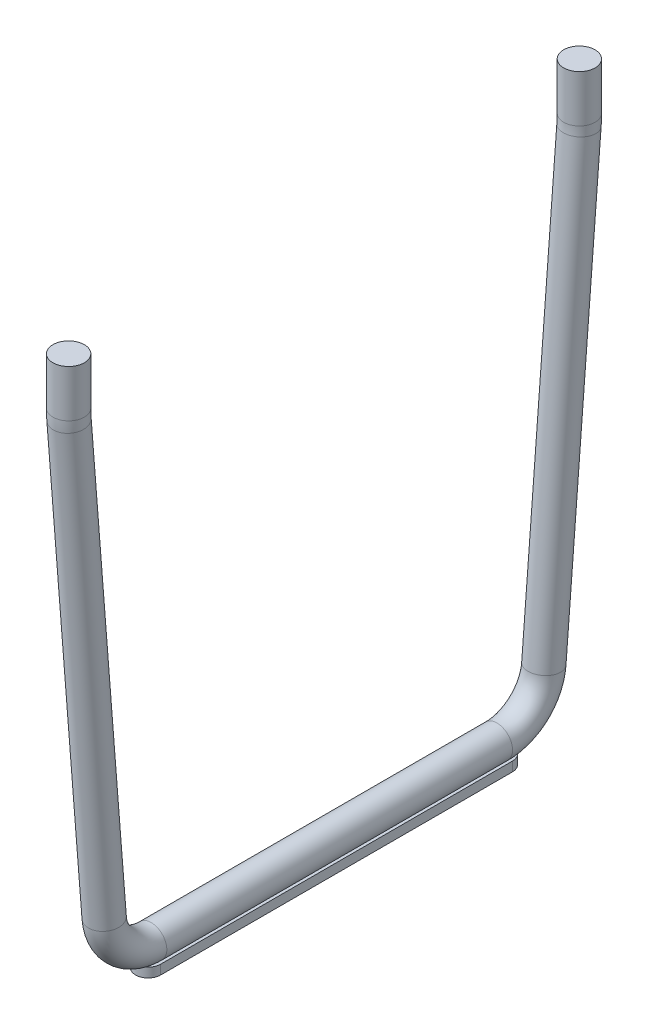
ISO-10303-21;
HEADER;
FILE_DESCRIPTION(('STEP AP214'),'2;1');
FILE_NAME('part.step','',(''),(''),'','','');
FILE_SCHEMA(('AUTOMOTIVE_DESIGN { 1 0 10303 214 1 1 1 1 }'));
ENDSEC;
DATA;
#1=APPLICATION_CONTEXT('core data for automotive mechanical design processes');
#2=APPLICATION_PROTOCOL_DEFINITION('international standard','automotive_design',2000,#1);
#3=PRODUCT_CONTEXT('',#1,'mechanical');
#4=PRODUCT('Part','Part','',(#3));
#5=PRODUCT_RELATED_PRODUCT_CATEGORY('part','',(#4));
#6=PRODUCT_DEFINITION_FORMATION('','',#4);
#7=PRODUCT_DEFINITION_CONTEXT('part definition',#1,'design');
#8=PRODUCT_DEFINITION('design','',#6,#7);
#9=PRODUCT_DEFINITION_SHAPE('','',#8);
#10=(LENGTH_UNIT() NAMED_UNIT(*) SI_UNIT(.MILLI.,.METRE.));
#11=(NAMED_UNIT(*) PLANE_ANGLE_UNIT() SI_UNIT($,.RADIAN.));
#12=(NAMED_UNIT(*) SI_UNIT($,.STERADIAN.) SOLID_ANGLE_UNIT());
#13=UNCERTAINTY_MEASURE_WITH_UNIT(LENGTH_MEASURE(1.E-05),#10,'distance_accuracy_value','');
#14=(GEOMETRIC_REPRESENTATION_CONTEXT(3) GLOBAL_UNCERTAINTY_ASSIGNED_CONTEXT((#13)) GLOBAL_UNIT_ASSIGNED_CONTEXT((#10,
#11,#12)) REPRESENTATION_CONTEXT('',''));
#15=CARTESIAN_POINT('',(0.,0.,0.));
#16=DIRECTION('',(0.,0.,1.));
#17=DIRECTION('',(1.,0.,0.));
#18=AXIS2_PLACEMENT_3D('',#15,#16,#17);
#19=CARTESIAN_POINT('',(-81.3172798364531,-160.,-55.0457603022725));
#20=DIRECTION('',(1.,0.,0.));
#21=DIRECTION('',(0.,0.,-1.));
#22=AXIS2_PLACEMENT_3D('',#19,#20,#21);
#23=TOROIDAL_SURFACE('',#22,15.,5.00000000000001);
#24=CARTESIAN_POINT('',(-81.3172798364531,-161.170775410961,-70.));
#25=DIRECTION('',(0.,-0.996949313181834,0.0780516940640648));
#26=DIRECTION('',(1.,0.,0.));
#27=AXIS2_PLACEMENT_3D('',#24,#25,#26);
#28=CIRCLE('',#27,5.00000000000001);
#29=CARTESIAN_POINT('',(-76.3172798364531,-161.170775410961,-70.));
#30=VERTEX_POINT('',#29);
#31=EDGE_CURVE('E300',#30,#30,#28,.F.);
#32=ORIENTED_EDGE('',*,*,#31,.F.);
#33=EDGE_LOOP('',(#32));
#34=FACE_BOUND('',#33,.T.);
#35=CARTESIAN_POINT('',(-79.0862215590178,-178.9998,-59.3199968317285));
#36=CARTESIAN_POINT('',(-79.169367727524,-179.029735643124,-59.3758802048314));
#37=CARTESIAN_POINT('',(-79.2549561550328,-179.058397606972,-59.4288529747976));
#38=CARTESIAN_POINT('',(-79.4306468485152,-179.11275761577,-59.5285704859976));
#39=CARTESIAN_POINT('',(-79.5207514799555,-179.138454083706,-59.575311915511));
#40=CARTESIAN_POINT('',(-79.7052966036937,-179.186507261533,-59.6622324784263));
#41=CARTESIAN_POINT('',(-79.7997495072829,-179.208853522922,-59.7023911165849));
#42=CARTESIAN_POINT('',(-79.992178001123,-179.24972836247,-59.7755392373545));
#43=CARTESIAN_POINT('',(-80.0901529700001,-179.268257610192,-59.8085299773844));
#44=CARTESIAN_POINT('',(-80.2893459073923,-179.301229651645,-59.8670612651401));
#45=CARTESIAN_POINT('',(-80.3905736194658,-179.315658581929,-59.8925765466432));
#46=CARTESIAN_POINT('',(-80.5952704678786,-179.340085724387,-59.9356887093938));
#47=CARTESIAN_POINT('',(-80.6987404129487,-179.350082309032,-59.9532826820217));
#48=CARTESIAN_POINT('',(-80.9068149185006,-179.365427317179,-59.9802631924802));
#49=CARTESIAN_POINT('',(-81.0114158516755,-179.370787697407,-59.9896708431398));
#50=CARTESIAN_POINT('',(-81.2212067143569,-179.376802477825,-60.0002256871071));
#51=CARTESIAN_POINT('',(-81.3263968373818,-179.377455228591,-60.0013699851646));
#52=CARTESIAN_POINT('',(-81.5303944125269,-179.374134989138,-59.9955450724465));
#53=CARTESIAN_POINT('',(-81.6292195189315,-179.370427060501,-59.9890407794159));
#54=CARTESIAN_POINT('',(-81.8258890715892,-179.358887034221,-59.968766675305));
#55=CARTESIAN_POINT('',(-81.923733163935,-179.351053499187,-59.954994331981));
#56=CARTESIAN_POINT('',(-82.21499919901,-179.32150555249,-59.9029389006433));
#57=CARTESIAN_POINT('',(-82.4060239199935,-179.293746146601,-59.853921399187));
#58=CARTESIAN_POINT('',(-82.7628909632749,-179.226465301806,-59.7340449692033));
#59=CARTESIAN_POINT('',(-82.9295546903508,-179.187944049624,-59.665029996011));
#60=CARTESIAN_POINT('',(-83.1695293847855,-179.122581002155,-59.5464234373317));
#61=CARTESIAN_POINT('',(-83.2477557290615,-179.09956456284,-59.5044381395747));
#62=CARTESIAN_POINT('',(-83.4007142590225,-179.051291746232,-59.4157153258954));
#63=CARTESIAN_POINT('',(-83.4754474969799,-179.026036050226,-59.3689792547537));
#64=CARTESIAN_POINT('',(-83.5483381138885,-178.9998,-59.3199968317285));
#65=B_SPLINE_CURVE_WITH_KNOTS('',3,(#35,#36,#37,#38,#39,#40,#41,#42,#43,#44,#45,#46,#47,#48,#49,
#50,#51,#52,#53,#54,#55,#56,#57,#58,#59,#60,#61,#62,#63,#64),.UNSPECIFIED.,.F.,.F.,(4,2,2,2,2,2,
2,2,2,2,2,2,2,2,4),(0.,0.313630571562977,0.627427166949149,0.942182923687225,1.25688342016068,
1.57263561318508,1.88850365264776,2.20355462149767,2.51871597013944,2.81566968599233,
3.11272693113772,3.70722958182025,4.2585732237628,4.53353214652676,4.80840769895938),.UNSPECIFIED.);
#66=CARTESIAN_POINT('',(-79.0867773788609,-179.,-59.3203702785495));
#67=VERTEX_POINT('',#66);
#68=CARTESIAN_POINT('',(-83.5477822940649,-179.,-59.3203702785364));
#69=VERTEX_POINT('',#68);
#70=EDGE_CURVE('E127',#67,#69,#65,.T.);
#71=ORIENTED_EDGE('',*,*,#70,.T.);
#72=CARTESIAN_POINT('',(-81.3172798364538,-179.,-61.2907583006709));
#73=CARTESIAN_POINT('',(-81.2205646462681,-179.,-61.2907453755615));
#74=CARTESIAN_POINT('',(-81.1237288878707,-179.,-61.2816733899027));
#75=CARTESIAN_POINT('',(-80.933204296533,-179.,-61.2462677195392));
#76=CARTESIAN_POINT('',(-80.8395222291852,-179.,-61.2198991366551));
#77=CARTESIAN_POINT('',(-80.6585368745128,-179.,-61.1525364866818));
#78=CARTESIAN_POINT('',(-80.5711879959494,-179.,-61.1116628316447));
#79=CARTESIAN_POINT('',(-80.4032253853747,-179.,-61.0180423665566));
#80=CARTESIAN_POINT('',(-80.3226126711372,-179.,-60.9652937667399));
#81=CARTESIAN_POINT('',(-80.1167859939407,-179.,-60.812088196327));
#82=CARTESIAN_POINT('',(-79.9977820158149,-179.,-60.703311381202));
#83=CARTESIAN_POINT('',(-79.7777285104847,-179.,-60.4688515924838));
#84=CARTESIAN_POINT('',(-79.6767377756761,-179.,-60.3431155295226));
#85=CARTESIAN_POINT('',(-79.5017178791633,-179.,-60.0965001931287));
#86=CARTESIAN_POINT('',(-79.4259061281468,-179.,-59.9768626641533));
#87=CARTESIAN_POINT('',(-79.2847847331316,-179.,-59.7314877367035));
#88=CARTESIAN_POINT('',(-79.2194834738101,-179.,-59.6057455713526));
#89=CARTESIAN_POINT('',(-79.0979808409895,-179.,-59.3497637691804));
#90=CARTESIAN_POINT('',(-79.0417925394294,-179.,-59.2195179912799));
#91=CARTESIAN_POINT('',(-78.9374813579276,-179.,-58.9558150575283));
#92=CARTESIAN_POINT('',(-78.8893615543251,-179.,-58.8223566988692));
#93=CARTESIAN_POINT('',(-78.7557182438728,-179.,-58.4185556707615));
#94=CARTESIAN_POINT('',(-78.6808561956768,-179.,-58.1446663097418));
#95=CARTESIAN_POINT('',(-78.5541801741231,-179.,-57.5915426777685));
#96=CARTESIAN_POINT('',(-78.5023893951529,-179.,-57.3123033210216));
#97=CARTESIAN_POINT('',(-78.4184639789512,-179.,-56.7502184217945));
#98=CARTESIAN_POINT('',(-78.3863784481961,-179.,-56.4673656488676));
#99=CARTESIAN_POINT('',(-78.3400871780308,-179.,-55.9003624738529));
#100=CARTESIAN_POINT('',(-78.3258740282082,-179.,-55.6162126586371));
#101=CARTESIAN_POINT('',(-78.3137605206338,-179.,-55.0140436713273));
#102=CARTESIAN_POINT('',(-78.3179802604204,-179.,-54.6959798389121));
#103=CARTESIAN_POINT('',(-78.3479580440064,-179.,-54.0606830819797));
#104=CARTESIAN_POINT('',(-78.3737285185839,-179.,-53.7434507430439));
#105=CARTESIAN_POINT('',(-78.4487734661825,-179.,-53.1117194707133));
#106=CARTESIAN_POINT('',(-78.4980417402729,-179.,-52.7972198386735));
#107=CARTESIAN_POINT('',(-78.5925380787229,-179.,-52.329812595695));
#108=CARTESIAN_POINT('',(-78.6274515550841,-179.,-52.1747934892552));
#109=CARTESIAN_POINT('',(-78.7049131529858,-179.,-51.8666875828148));
#110=CARTESIAN_POINT('',(-78.7474596075282,-179.,-51.7136003686982));
#111=CARTESIAN_POINT('',(-78.8440209160247,-179.,-51.4006836892627));
#112=CARTESIAN_POINT('',(-78.8985812680761,-179.,-51.2410207545158));
#113=CARTESIAN_POINT('',(-79.01880256523,-179.,-50.9259766474756));
#114=CARTESIAN_POINT('',(-79.084457230037,-179.,-50.770593110246));
#115=CARTESIAN_POINT('',(-79.2282861969638,-179.,-50.4668969742585));
#116=CARTESIAN_POINT('',(-79.3063761893366,-179.,-50.318544919631));
#117=CARTESIAN_POINT('',(-79.4775890490827,-179.,-50.0309026807214));
#118=CARTESIAN_POINT('',(-79.570685704806,-179.,-49.8915972795732));
#119=CARTESIAN_POINT('',(-79.7449501141511,-179.,-49.665186604054));
#120=CARTESIAN_POINT('',(-79.8216931643026,-179.,-49.5746961598009));
#121=CARTESIAN_POINT('',(-79.9852180124048,-179.,-49.4029609826336));
#122=CARTESIAN_POINT('',(-80.0720092893508,-179.,-49.3217251257086));
#123=CARTESIAN_POINT('',(-80.2571842661508,-179.,-49.1713696158977));
#124=CARTESIAN_POINT('',(-80.3556773747095,-179.,-49.1023822746638));
#125=CARTESIAN_POINT('',(-80.563149814535,-179.,-48.9825117012813));
#126=CARTESIAN_POINT('',(-80.6721053835254,-179.,-48.9315886221645));
#127=CARTESIAN_POINT('',(-80.8706258635453,-179.,-48.8626130766746));
#128=CARTESIAN_POINT('',(-80.9584528121524,-179.,-48.839576111845));
#129=CARTESIAN_POINT('',(-81.1367352798331,-179.,-48.808645990184));
#130=CARTESIAN_POINT('',(-81.227188808831,-179.,-48.8007416568611));
#131=CARTESIAN_POINT('',(-81.4081958565263,-179.,-48.8007830579139));
#132=CARTESIAN_POINT('',(-81.4987493705825,-179.,-48.8087470309984));
#133=CARTESIAN_POINT('',(-81.6772131557325,-179.,-48.8398283204879));
#134=CARTESIAN_POINT('',(-81.7651216008113,-179.,-48.8629558648781));
#135=CARTESIAN_POINT('',(-81.9557391592699,-179.,-48.9293423579115));
#136=CARTESIAN_POINT('',(-82.0572616676438,-179.,-48.9759857091945));
#137=CARTESIAN_POINT('',(-82.2513458440135,-179.,-49.0851353341859));
#138=CARTESIAN_POINT('',(-82.3438917582014,-179.,-49.1476688229714));
#139=CARTESIAN_POINT('',(-82.5622502120253,-179.,-49.3178680836123));
#140=CARTESIAN_POINT('',(-82.6824217077324,-179.,-49.4327118565849));
#141=CARTESIAN_POINT('',(-82.9039445974847,-179.,-49.6792043625218));
#142=CARTESIAN_POINT('',(-83.0052506545281,-179.,-49.8108923271233));
#143=CARTESIAN_POINT('',(-83.1815338319027,-179.,-50.0702659462697));
#144=CARTESIAN_POINT('',(-83.258173769825,-179.,-50.1968427203846));
#145=CARTESIAN_POINT('',(-83.4003764199002,-179.,-50.4561335365671));
#146=CARTESIAN_POINT('',(-83.4659301529328,-179.,-50.5888524436202));
#147=CARTESIAN_POINT('',(-83.587485156391,-179.,-50.8587933186852));
#148=CARTESIAN_POINT('',(-83.643471691665,-179.,-50.9960218515946));
#149=CARTESIAN_POINT('',(-83.7469963691426,-179.,-51.2736508522786));
#150=CARTESIAN_POINT('',(-83.7945313051214,-179.,-51.4140525011469));
#151=CARTESIAN_POINT('',(-83.9260039366949,-179.,-51.8388367235698));
#152=CARTESIAN_POINT('',(-83.9987660980875,-179.,-52.126697438461));
#153=CARTESIAN_POINT('',(-84.1201206949504,-179.,-52.7075453665497));
#154=CARTESIAN_POINT('',(-84.1686886176778,-179.,-53.0005374689279));
#155=CARTESIAN_POINT('',(-84.2450867427398,-179.,-53.5901184607017));
#156=CARTESIAN_POINT('',(-84.2728506979201,-179.,-53.8867158093599));
#157=CARTESIAN_POINT('',(-84.3092419245985,-179.,-54.4809085428742));
#158=CARTESIAN_POINT('',(-84.3178780469392,-179.,-54.7785034022906));
#159=CARTESIAN_POINT('',(-84.3165471729601,-179.,-55.4066684920266));
#160=CARTESIAN_POINT('',(-84.3044106351013,-179.,-55.7372352392924));
#161=CARTESIAN_POINT('',(-84.2562910533076,-179.,-56.3970056817633));
#162=CARTESIAN_POINT('',(-84.2202880535951,-179.,-56.7262080041265));
#163=CARTESIAN_POINT('',(-84.1460960407634,-179.,-57.2167986005384));
#164=CARTESIAN_POINT('',(-84.118012207419,-179.,-57.3797450276671));
#165=CARTESIAN_POINT('',(-84.0544738506024,-179.,-57.7041840526441));
#166=CARTESIAN_POINT('',(-84.0190206591656,-179.,-57.8656769077343));
#167=CARTESIAN_POINT('',(-83.9400067874774,-179.,-58.1863917640435));
#168=CARTESIAN_POINT('',(-83.8964599635975,-179.,-58.3456171529671));
#169=CARTESIAN_POINT('',(-83.8001596505525,-179.,-58.6613288754695));
#170=CARTESIAN_POINT('',(-83.7474041438033,-179.,-58.8178146005152));
#171=CARTESIAN_POINT('',(-83.6339047990144,-179.,-59.1200531719077));
#172=CARTESIAN_POINT('',(-83.5736154513428,-179.,-59.2659750988366));
#173=CARTESIAN_POINT('',(-83.4419430879331,-179.,-59.5526657578668));
#174=CARTESIAN_POINT('',(-83.370568282959,-179.,-59.693438209488));
#175=CARTESIAN_POINT('',(-83.2154666911817,-179.,-59.9665958291704));
#176=CARTESIAN_POINT('',(-83.1318444183772,-179.,-60.0990395986654));
#177=CARTESIAN_POINT('',(-82.9497840557672,-179.,-60.353173139268));
#178=CARTESIAN_POINT('',(-82.8513783153413,-179.,-60.4748854922784));
#179=CARTESIAN_POINT('',(-82.6663739038587,-179.,-60.6716104538613));
#180=CARTESIAN_POINT('',(-82.5837728877214,-179.,-60.7503537320377));
#181=CARTESIAN_POINT('',(-82.4086698673105,-179.,-60.8963844243847));
#182=CARTESIAN_POINT('',(-82.3161574455488,-179.,-60.9636595886375));
#183=CARTESIAN_POINT('',(-82.1201667144409,-179.,-61.083371661906));
#184=CARTESIAN_POINT('',(-82.0165631063509,-179.,-61.1356074404645));
#185=CARTESIAN_POINT('',(-81.8013256060678,-179.,-61.2190336378852));
#186=CARTESIAN_POINT('',(-81.6897251353857,-179.,-61.2503065700413));
#187=CARTESIAN_POINT('',(-81.5334594670412,-179.,-61.2763689218203));
#188=CARTESIAN_POINT('',(-81.4904135255711,-179.,-61.2817494810562));
#189=CARTESIAN_POINT('',(-81.4040131319072,-179.,-61.2889474755397));
#190=CARTESIAN_POINT('',(-81.3606586115892,-179.,-61.2907640978514));
#191=CARTESIAN_POINT('',(-81.3172798364538,-179.,-61.2907583006709));
#192=B_SPLINE_CURVE_WITH_KNOTS('',3,(#72,#73,#74,#75,#76,#77,#78,#79,#80,#81,#82,#83,#84,#85,
#86,#87,#88,#89,#90,#91,#92,#93,#94,#95,#96,#97,#98,#99,#100,#101,#102,#103,#104,#105,#106,#107,
#108,#109,#110,#111,#112,#113,#114,#115,#116,#117,#118,#119,#120,#121,#122,#123,#124,#125,#126,
#127,#128,#129,#130,#131,#132,#133,#134,#135,#136,#137,#138,#139,#140,#141,#142,#143,#144,#145,
#146,#147,#148,#149,#150,#151,#152,#153,#154,#155,#156,#157,#158,#159,#160,#161,#162,#163,#164,
#165,#166,#167,#168,#169,#170,#171,#172,#173,#174,#175,#176,#177,#178,#179,#180,#181,#182,#183,
#184,#185,#186,#187,#188,#189,#190,#191),.UNSPECIFIED.,.T.,.F.,(4,2,2,2,2,2,2,2,2,2,2,2,2,2,2,2,
2,2,2,2,2,2,2,2,2,2,2,2,2,2,2,2,2,2,2,2,2,2,2,2,2,2,2,2,2,2,2,2,2,2,2,2,2,2,2,2,2,2,2,4),(0.,
0.289955337734272,0.580497505758689,0.868682121121259,1.15691020015143,1.63782204548688,
2.12027588051028,2.5445699827976,2.96920090309242,3.39443564199772,3.81983214659893,
4.6702297837641,5.52148043782028,6.37484393381686,7.22785348352901,8.18140035648005,
9.13549762886421,10.0893433409205,10.565894662757,11.0423420349713,11.5481760611165,
12.0537246969154,12.5559812866462,13.0573699222904,13.4127062799225,13.7683806181997,
14.1276899247613,14.486201648585,14.7574225101138,15.0284429789485,15.2997751328922,
15.5712904917118,15.9046180867583,16.2385204666091,16.7344023963371,17.2314610589837,
17.674733352561,18.1183629666726,18.562669807041,19.0071448430493,19.8964232071927,
20.7866007333603,21.6796009904996,22.5721879516099,23.5637733188278,24.5561888408756,
25.0520998330439,25.5479212655049,26.0429015381992,26.5379903954414,27.0112612855368,
27.4841832910534,27.9532823295851,28.4213694412107,28.762939655576,29.104872469992,
29.4511857083494,29.7961276669689,29.9261490145077,30.0562000165346),.UNSPECIFIED.);
#193=CARTESIAN_POINT('',(-84.3172798364531,-179.,-55.0457603022725));
#194=VERTEX_POINT('',#193);
#195=EDGE_CURVE('E50',#194,#69,#192,.T.);
#196=ORIENTED_EDGE('',*,*,#195,.F.);
#197=CARTESIAN_POINT('',(-81.3172798364531,-175.,-55.0457603022725));
#198=DIRECTION('',(0.,0.,1.));
#199=DIRECTION('',(1.,0.,0.));
#200=AXIS2_PLACEMENT_3D('',#197,#198,#199);
#201=CIRCLE('',#200,5.00000000000001);
#202=CARTESIAN_POINT('',(-78.3172798364531,-179.,-55.0457603022725));
#203=VERTEX_POINT('',#202);
#204=EDGE_CURVE('E228',#194,#203,#201,.F.);
#205=ORIENTED_EDGE('',*,*,#204,.T.);
#206=EDGE_CURVE('E13',#67,#203,#192,.T.);
#207=ORIENTED_EDGE('',*,*,#206,.F.);
#208=EDGE_LOOP('',(#71,#196,#205,#207));
#209=FACE_BOUND('',#208,.T.);
#210=ADVANCED_FACE('F46',(#34,#209),#23,.T.);
#211=CARTESIAN_POINT('',(-81.3172798364531,-160.,55.0457603022725));
#212=DIRECTION('',(-1.,0.,0.));
#213=DIRECTION('',(0.,0.,1.));
#214=AXIS2_PLACEMENT_3D('',#211,#212,#213);
#215=TOROIDAL_SURFACE('',#214,15.,5.00000000000001);
#216=CARTESIAN_POINT('',(-81.3172798364531,-161.170775410961,70.));
#217=DIRECTION('',(0.,0.996949313181834,0.0780516940640648));
#218=DIRECTION('',(1.,0.,0.));
#219=AXIS2_PLACEMENT_3D('',#216,#217,#218);
#220=CIRCLE('',#219,5.00000000000001);
#221=CARTESIAN_POINT('',(-76.3172798364531,-161.170775410961,70.));
#222=VERTEX_POINT('',#221);
#223=EDGE_CURVE('E229',#222,#222,#220,.T.);
#224=ORIENTED_EDGE('',*,*,#223,.F.);
#225=EDGE_LOOP('',(#224));
#226=FACE_BOUND('',#225,.T.);
#227=CARTESIAN_POINT('',(-83.5483381138885,-178.9998,59.3199968317285));
#228=CARTESIAN_POINT('',(-83.4651919453823,-179.029735643124,59.3758802048314));
#229=CARTESIAN_POINT('',(-83.3796035178735,-179.058397606972,59.4288529747976));
#230=CARTESIAN_POINT('',(-83.2039128243911,-179.11275761577,59.5285704859976));
#231=CARTESIAN_POINT('',(-83.1138081929508,-179.138454083706,59.575311915511));
#232=CARTESIAN_POINT('',(-82.9292630692126,-179.186507261533,59.6622324784264));
#233=CARTESIAN_POINT('',(-82.8348101656234,-179.208853522922,59.7023911165849));
#234=CARTESIAN_POINT('',(-82.6423816717833,-179.24972836247,59.7755392373545));
#235=CARTESIAN_POINT('',(-82.5444067029061,-179.268257610192,59.8085299773844));
#236=CARTESIAN_POINT('',(-82.345213765514,-179.301229651645,59.8670612651401));
#237=CARTESIAN_POINT('',(-82.2439860534405,-179.315658581929,59.8925765466433));
#238=CARTESIAN_POINT('',(-82.0392892050277,-179.340085724387,59.9356887093938));
#239=CARTESIAN_POINT('',(-81.9358192599576,-179.350082309032,59.9532826820218));
#240=CARTESIAN_POINT('',(-81.7277447544057,-179.365427317179,59.9802631924802));
#241=CARTESIAN_POINT('',(-81.6231438212308,-179.370787697407,59.9896708431398));
#242=CARTESIAN_POINT('',(-81.4133529585494,-179.376802477825,60.0002256871071));
#243=CARTESIAN_POINT('',(-81.3081628355245,-179.377455228591,60.0013699851646));
#244=CARTESIAN_POINT('',(-81.1041652603793,-179.374134989138,59.9955450724465));
#245=CARTESIAN_POINT('',(-81.0053401539747,-179.370427060501,59.9890407794159));
#246=CARTESIAN_POINT('',(-80.8086706013171,-179.358887034221,59.968766675305));
#247=CARTESIAN_POINT('',(-80.7108265089712,-179.351053499187,59.954994331981));
#248=CARTESIAN_POINT('',(-80.4195604738963,-179.32150555249,59.9029389006433));
#249=CARTESIAN_POINT('',(-80.2285357529127,-179.293746146601,59.853921399187));
#250=CARTESIAN_POINT('',(-79.8716687096313,-179.226465301806,59.7340449692033));
#251=CARTESIAN_POINT('',(-79.7050049825555,-179.187944049624,59.665029996011));
#252=CARTESIAN_POINT('',(-79.4650302881208,-179.122581002155,59.5464234373317));
#253=CARTESIAN_POINT('',(-79.3868039438448,-179.09956456284,59.5044381395747));
#254=CARTESIAN_POINT('',(-79.2338454138838,-179.051291746232,59.4157153258954));
#255=CARTESIAN_POINT('',(-79.1591121759264,-179.026036050226,59.3689792547537));
#256=CARTESIAN_POINT('',(-79.0862215590178,-178.9998,59.3199968317285));
#257=B_SPLINE_CURVE_WITH_KNOTS('',3,(#227,#228,#229,#230,#231,#232,#233,#234,#235,#236,#237,
#238,#239,#240,#241,#242,#243,#244,#245,#246,#247,#248,#249,#250,#251,#252,#253,#254,#255,#256),
.UNSPECIFIED.,.F.,.F.,(4,2,2,2,2,2,2,2,2,2,2,2,2,2,4),(0.,0.313630571562959,0.627427166949141,
0.942182923687211,1.2568834201607,1.57263561318507,1.88850365264777,2.20355462149767,
2.51871597013947,2.81566968599236,3.11272693113775,3.70722958182027,4.25857322376281,
4.53353214652675,4.80840769895938),.UNSPECIFIED.);
#258=CARTESIAN_POINT('',(-83.5477822940453,-179.,59.3203702785496));
#259=VERTEX_POINT('',#258);
#260=CARTESIAN_POINT('',(-79.0867773788414,-178.999999999993,59.3203702785364));
#261=VERTEX_POINT('',#260);
#262=EDGE_CURVE('E206',#259,#261,#257,.T.);
#263=ORIENTED_EDGE('',*,*,#262,.T.);
#264=CARTESIAN_POINT('',(-81.3172798364538,-179.,61.2907583006709));
#265=CARTESIAN_POINT('',(-81.4139950266396,-179.,61.2907453755615));
#266=CARTESIAN_POINT('',(-81.5108307850371,-179.,61.2816733899026));
#267=CARTESIAN_POINT('',(-81.7013553763747,-179.,61.2462677195388));
#268=CARTESIAN_POINT('',(-81.7950374437226,-179.,61.2198991366546));
#269=CARTESIAN_POINT('',(-81.976022798395,-179.,61.1525364866812));
#270=CARTESIAN_POINT('',(-82.0633716769584,-179.,61.1116628316439));
#271=CARTESIAN_POINT('',(-82.2313342875331,-179.,61.0180423665556));
#272=CARTESIAN_POINT('',(-82.3119470017706,-179.,60.9652937667388));
#273=CARTESIAN_POINT('',(-82.5177736789673,-179.,60.8120881963256));
#274=CARTESIAN_POINT('',(-82.636777657093,-179.,60.7033113812004));
#275=CARTESIAN_POINT('',(-82.8568311624233,-179.,60.4688515924817));
#276=CARTESIAN_POINT('',(-82.957821897232,-179.,60.3431155295202));
#277=CARTESIAN_POINT('',(-83.1328417937448,-179.,60.0965001931259));
#278=CARTESIAN_POINT('',(-83.2086535447613,-179.,59.9768626641503));
#279=CARTESIAN_POINT('',(-83.3497749397766,-179.,59.7314877367));
#280=CARTESIAN_POINT('',(-83.4150761990981,-179.,59.6057455713487));
#281=CARTESIAN_POINT('',(-83.5365788319187,-179.,59.349763769176));
#282=CARTESIAN_POINT('',(-83.5927671334788,-179.,59.2195179912753));
#283=CARTESIAN_POINT('',(-83.6970783149806,-179.,58.9558150575232));
#284=CARTESIAN_POINT('',(-83.7451981185831,-179.,58.8223566988638));
#285=CARTESIAN_POINT('',(-83.8788414290353,-179.,58.4185556707553));
#286=CARTESIAN_POINT('',(-83.9537034772312,-179.,58.1446663097351));
#287=CARTESIAN_POINT('',(-84.0803794987848,-179.,57.5915426777608));
#288=CARTESIAN_POINT('',(-84.1321702777549,-179.,57.3123033210133));
#289=CARTESIAN_POINT('',(-84.2160956939563,-179.,56.7502184217852));
#290=CARTESIAN_POINT('',(-84.2481812247112,-179.,56.4673656488578));
#291=CARTESIAN_POINT('',(-84.2944724948761,-179.,55.900362473842));
#292=CARTESIAN_POINT('',(-84.3086856446986,-179.,55.6162126586258));
#293=CARTESIAN_POINT('',(-84.3207991522724,-179.,55.0140436713149));
#294=CARTESIAN_POINT('',(-84.3165794124855,-179.,54.6959798388993));
#295=CARTESIAN_POINT('',(-84.2866016288989,-179.,54.0606830819659));
#296=CARTESIAN_POINT('',(-84.260831154321,-179.,53.7434507430296));
#297=CARTESIAN_POINT('',(-84.1857862067215,-179.,53.1117194706982));
#298=CARTESIAN_POINT('',(-84.1365179326307,-179.,52.797219838658));
#299=CARTESIAN_POINT('',(-84.0420215941798,-179.,52.3298125956789));
#300=CARTESIAN_POINT('',(-84.0071081178183,-179.,52.1747934892389));
#301=CARTESIAN_POINT('',(-83.929646519916,-179.,51.8666875827982));
#302=CARTESIAN_POINT('',(-83.8871000653733,-179.,51.7136003686814));
#303=CARTESIAN_POINT('',(-83.7905387568761,-179.,51.4006836892463));
#304=CARTESIAN_POINT('',(-83.7359784048245,-179.,51.2410207544998));
#305=CARTESIAN_POINT('',(-83.6157571076701,-179.,50.9259766474606));
#306=CARTESIAN_POINT('',(-83.5501024428629,-179.,50.7705931102315));
#307=CARTESIAN_POINT('',(-83.4062734759356,-179.,50.4668969742451));
#308=CARTESIAN_POINT('',(-83.3281834835626,-179.,50.3185449196181));
#309=CARTESIAN_POINT('',(-83.156970623816,-179.,50.0309026807098));
#310=CARTESIAN_POINT('',(-83.0638739680925,-179.,49.8915972795621));
#311=CARTESIAN_POINT('',(-82.8896095587471,-179.,49.6651866040442));
#312=CARTESIAN_POINT('',(-82.8128665085956,-179.,49.5746961597917));
#313=CARTESIAN_POINT('',(-82.6493416604934,-179.,49.4029609826257));
#314=CARTESIAN_POINT('',(-82.5625503835473,-179.,49.3217251257014));
#315=CARTESIAN_POINT('',(-82.3773754067474,-179.,49.1713696158918));
#316=CARTESIAN_POINT('',(-82.2788822981888,-179.,49.1023822746586));
#317=CARTESIAN_POINT('',(-82.0714098583636,-179.,48.9825117012774));
#318=CARTESIAN_POINT('',(-81.9624542893734,-179.,48.9315886221614));
#319=CARTESIAN_POINT('',(-81.7639338093536,-179.,48.8626130766724));
#320=CARTESIAN_POINT('',(-81.6761068607466,-179.,48.8395761118433));
#321=CARTESIAN_POINT('',(-81.4978243930659,-179.,48.8086459901832));
#322=CARTESIAN_POINT('',(-81.4073708640681,-179.,48.8007416568607));
#323=CARTESIAN_POINT('',(-81.2263638163729,-179.,48.8007830579144));
#324=CARTESIAN_POINT('',(-81.1358103023169,-179.,48.8087470309992));
#325=CARTESIAN_POINT('',(-80.9573465171672,-179.,48.8398283204894));
#326=CARTESIAN_POINT('',(-80.8694380720885,-179.,48.86295586488));
#327=CARTESIAN_POINT('',(-80.6788205136299,-179.,48.9293423579142));
#328=CARTESIAN_POINT('',(-80.5772980052559,-179.,48.9759857091977));
#329=CARTESIAN_POINT('',(-80.383213828886,-179.,49.0851353341902));
#330=CARTESIAN_POINT('',(-80.290667914698,-179.,49.1476688229762));
#331=CARTESIAN_POINT('',(-80.0723094608737,-179.,49.3178680836187));
#332=CARTESIAN_POINT('',(-79.9521379651664,-179.,49.4327118565924));
#333=CARTESIAN_POINT('',(-79.7306150754137,-179.,49.6792043625315));
#334=CARTESIAN_POINT('',(-79.6293090183702,-179.,49.810892327134));
#335=CARTESIAN_POINT('',(-79.4530258409954,-179.,50.0702659462826));
#336=CARTESIAN_POINT('',(-79.3763859030729,-179.,50.1968427203987));
#337=CARTESIAN_POINT('',(-79.2341832529976,-179.,50.4561335365836));
#338=CARTESIAN_POINT('',(-79.168629519965,-179.,50.588852443638));
#339=CARTESIAN_POINT('',(-79.0470745165068,-179.,50.8587933187054));
#340=CARTESIAN_POINT('',(-78.9910879812328,-179.,50.996021851616));
#341=CARTESIAN_POINT('',(-78.8875633037553,-179.,51.2736508523024));
#342=CARTESIAN_POINT('',(-78.8400283677767,-179.,51.4140525011719));
#343=CARTESIAN_POINT('',(-78.7085557362035,-179.,51.8388367235983));
#344=CARTESIAN_POINT('',(-78.6357935748113,-179.,52.1266974384918));
#345=CARTESIAN_POINT('',(-78.5144389779495,-179.,52.7075453665852));
#346=CARTESIAN_POINT('',(-78.4658710552226,-179.,53.0005374689657));
#347=CARTESIAN_POINT('',(-78.3894729301619,-179.,53.5901184607441));
#348=CARTESIAN_POINT('',(-78.3617089749824,-179.,53.8867158094047));
#349=CARTESIAN_POINT('',(-78.3253177483057,-179.,54.4809085429235));
#350=CARTESIAN_POINT('',(-78.316681625966,-179.,54.7785034023423));
#351=CARTESIAN_POINT('',(-78.3180124999475,-179.,55.4066684920826));
#352=CARTESIAN_POINT('',(-78.3301490378077,-179.,55.7372352393504));
#353=CARTESIAN_POINT('',(-78.3782686196046,-179.,56.3970056818253));
#354=CARTESIAN_POINT('',(-78.414271619319,-179.,56.7262080041905));
#355=CARTESIAN_POINT('',(-78.4884636321539,-179.,57.2167986006051));
#356=CARTESIAN_POINT('',(-78.5165474654994,-179.,57.3797450277346));
#357=CARTESIAN_POINT('',(-78.5800858223185,-179.,57.7041840527133));
#358=CARTESIAN_POINT('',(-78.6155390137566,-179.,57.8656769078042));
#359=CARTESIAN_POINT('',(-78.6945528854477,-179.,58.1863917641148));
#360=CARTESIAN_POINT('',(-78.7380997093292,-179.,58.3456171530391));
#361=CARTESIAN_POINT('',(-78.8344000223776,-179.,58.6613288755426));
#362=CARTESIAN_POINT('',(-78.8871555291286,-179.,58.8178146005887));
#363=CARTESIAN_POINT('',(-79.0006548739205,-179.,59.120053171979));
#364=CARTESIAN_POINT('',(-79.060944221593,-179.,59.2659750989055));
#365=CARTESIAN_POINT('',(-79.1926165850045,-179.,59.5526657579305));
#366=CARTESIAN_POINT('',(-79.2639913899795,-179.,59.6934382095491));
#367=CARTESIAN_POINT('',(-79.4190929817585,-179.,59.966595829226));
#368=CARTESIAN_POINT('',(-79.5027152545638,-179.,60.0990395987181));
#369=CARTESIAN_POINT('',(-79.6847756171754,-179.,60.3531731393146));
#370=CARTESIAN_POINT('',(-79.7831813576021,-179.,60.4748854923219));
#371=CARTESIAN_POINT('',(-79.9681857690857,-179.,60.6716104538989));
#372=CARTESIAN_POINT('',(-80.0507867852233,-179.,60.7503537320727));
#373=CARTESIAN_POINT('',(-80.2258898056348,-179.,60.8963844244143));
#374=CARTESIAN_POINT('',(-80.3184022273965,-179.,60.9636595886642));
#375=CARTESIAN_POINT('',(-80.5143929585044,-179.,61.0833716619269));
#376=CARTESIAN_POINT('',(-80.6179965665941,-179.,61.1356074404824));
#377=CARTESIAN_POINT('',(-80.8332340668762,-179.,61.219033637897));
#378=CARTESIAN_POINT('',(-80.9448345375575,-179.,61.2503065700501));
#379=CARTESIAN_POINT('',(-81.1011002058953,-179.,61.2763689218243));
#380=CARTESIAN_POINT('',(-81.1441461473597,-179.,61.2817494810588));
#381=CARTESIAN_POINT('',(-81.2305465410121,-179.,61.2889474755402));
#382=CARTESIAN_POINT('',(-81.2739010613243,-179.,61.2907640978514));
#383=CARTESIAN_POINT('',(-81.3172798364538,-179.,61.2907583006709));
#384=B_SPLINE_CURVE_WITH_KNOTS('',3,(#264,#265,#266,#267,#268,#269,#270,#271,#272,#273,#274,
#275,#276,#277,#278,#279,#280,#281,#282,#283,#284,#285,#286,#287,#288,#289,#290,#291,#292,#293,
#294,#295,#296,#297,#298,#299,#300,#301,#302,#303,#304,#305,#306,#307,#308,#309,#310,#311,#312,
#313,#314,#315,#316,#317,#318,#319,#320,#321,#322,#323,#324,#325,#326,#327,#328,#329,#330,#331,
#332,#333,#334,#335,#336,#337,#338,#339,#340,#341,#342,#343,#344,#345,#346,#347,#348,#349,#350,
#351,#352,#353,#354,#355,#356,#357,#358,#359,#360,#361,#362,#363,#364,#365,#366,#367,#368,#369,
#370,#371,#372,#373,#374,#375,#376,#377,#378,#379,#380,#381,#382,#383),.UNSPECIFIED.,.T.,.F.,(4,
2,2,2,2,2,2,2,2,2,2,2,2,2,2,2,2,2,2,2,2,2,2,2,2,2,2,2,2,2,2,2,2,2,2,2,2,2,2,2,2,2,2,2,2,2,2,2,2,
2,2,2,2,2,2,2,2,2,2,4),(0.,0.289955337734408,0.580497505758989,0.868682121121681,
1.15691020015199,1.63782204548803,2.12027588051202,2.54456998280004,2.96920090309556,
3.39443564200156,3.81983214660347,4.67022978377011,5.52148043782777,6.37484393382585,
7.2278534835395,8.18140035649199,9.13549762887761,10.0893433409353,10.5658946627725,
11.0423420349876,11.5481760611316,12.0537246969294,12.5559812866591,13.0573699223021,
13.4127062799329,13.7683806182087,14.1276899247689,14.4862016485912,14.7574225101198,
15.0284429789543,15.2997751328976,15.571290491717,15.9046180867645,16.2385204666165,
16.7344023963472,17.2314610589965,17.6747333525771,18.118362966692,18.5626698070637,
19.0071448430752,19.8964232072252,20.7866007333994,21.6796009905454,22.5721879516623,
23.5637733188866,24.5561888409407,25.0520998331122,25.5479212655762,26.0429015382736,
26.5379903955188,27.0112612856083,27.484183291119,27.9532823296447,28.4213694412643,
28.762939655625,29.1048724700363,29.451185708389,29.7961276670037,29.9261490145251,
30.0562000165346),.UNSPECIFIED.);
#385=CARTESIAN_POINT('',(-78.3172798364531,-179.,55.0457603022725));
#386=VERTEX_POINT('',#385);
#387=EDGE_CURVE('E66',#386,#261,#384,.T.);
#388=ORIENTED_EDGE('',*,*,#387,.F.);
#389=CARTESIAN_POINT('',(-81.3172798364531,-175.,55.0457603022725));
#390=DIRECTION('',(0.,0.,1.));
#391=DIRECTION('',(1.,0.,0.));
#392=AXIS2_PLACEMENT_3D('',#389,#390,#391);
#393=CIRCLE('',#392,5.00000000000001);
#394=CARTESIAN_POINT('',(-84.3172798364531,-179.,55.0457603022725));
#395=VERTEX_POINT('',#394);
#396=EDGE_CURVE('E226',#386,#395,#393,.T.);
#397=ORIENTED_EDGE('',*,*,#396,.T.);
#398=EDGE_CURVE('E73',#259,#395,#384,.T.);
#399=ORIENTED_EDGE('',*,*,#398,.F.);
#400=EDGE_LOOP('',(#263,#388,#397,#399));
#401=FACE_BOUND('',#400,.T.);
#402=ADVANCED_FACE('F166',(#226,#401),#215,.T.);
#403=CARTESIAN_POINT('',(-81.3172798364531,0.,81.3172798364528));
#404=DIRECTION('',(0.,1.,0.));
#405=DIRECTION('',(1.,0.,0.));
#406=AXIS2_PLACEMENT_3D('',#403,#404,#405);
#407=PLANE('',#406);
#408=CARTESIAN_POINT('',(-81.3172798364531,0.,81.3172798364528));
#409=DIRECTION('',(0.,1.,0.));
#410=DIRECTION('',(1.,0.,0.));
#411=AXIS2_PLACEMENT_3D('',#408,#409,#410);
#412=CIRCLE('',#411,5.00000000000001);
#413=CARTESIAN_POINT('',(-76.3172798364531,0.,81.3172798364528));
#414=VERTEX_POINT('',#413);
#415=EDGE_CURVE('E244',#414,#414,#412,.T.);
#416=ORIENTED_EDGE('',*,*,#415,.T.);
#417=EDGE_LOOP('',(#416));
#418=FACE_BOUND('',#417,.T.);
#419=ADVANCED_FACE('F48',(#418),#407,.T.);
#420=CARTESIAN_POINT('',(-81.3172798364531,-175.,0.));
#421=DIRECTION('',(0.,0.,1.));
#422=DIRECTION('',(1.,0.,0.));
#423=AXIS2_PLACEMENT_3D('',#420,#421,#422);
#424=CYLINDRICAL_SURFACE('',#423,5.00000000000001);
#425=DIRECTION('',(0.,0.,1.));
#426=VECTOR('',#425,1.);
#427=CARTESIAN_POINT('',(-84.3172798364531,-179.,0.));
#428=LINE('',#427,#426);
#429=EDGE_CURVE('E153',#395,#194,#428,.F.);
#430=ORIENTED_EDGE('',*,*,#429,.F.);
#431=ORIENTED_EDGE('',*,*,#396,.F.);
#432=DIRECTION('',(0.,0.,1.));
#433=VECTOR('',#432,1.);
#434=CARTESIAN_POINT('',(-78.3172798364531,-179.,0.));
#435=LINE('',#434,#433);
#436=EDGE_CURVE('E164',#203,#386,#435,.T.);
#437=ORIENTED_EDGE('',*,*,#436,.F.);
#438=ORIENTED_EDGE('',*,*,#204,.F.);
#439=EDGE_LOOP('',(#430,#431,#437,#438));
#440=FACE_BOUND('',#439,.T.);
#441=ADVANCED_FACE('F225',(#440),#424,.T.);
#442=CARTESIAN_POINT('',(-81.3172798364531,-161.170775410961,70.));
#443=DIRECTION('',(0.,0.996949313181834,0.0780516940640646));
#444=DIRECTION('',(0.,-0.0780516940640646,0.996949313181834));
#445=AXIS2_PLACEMENT_3D('',#442,#443,#444);
#446=CYLINDRICAL_SURFACE('',#445,5.00000000000001);
#447=CARTESIAN_POINT('',(-81.3172798364531,-18.2268333227463,81.1911575530077));
#448=DIRECTION('',(0.,0.996949313181834,0.0780516940640646));
#449=DIRECTION('',(1.,0.,0.));
#450=AXIS2_PLACEMENT_3D('',#447,#448,#449);
#451=CIRCLE('',#450,5.00000000000001);
#452=CARTESIAN_POINT('',(-81.3172798364531,-18.6170917930665,86.1759041189169));
#453=VERTEX_POINT('',#452);
#454=EDGE_CURVE('E233',#453,#453,#451,.T.);
#455=ORIENTED_EDGE('',*,*,#454,.F.);
#456=EDGE_LOOP('',(#455));
#457=FACE_BOUND('',#456,.T.);
#458=ORIENTED_EDGE('',*,*,#223,.T.);
#459=EDGE_LOOP('',(#458));
#460=FACE_BOUND('',#459,.T.);
#461=ADVANCED_FACE('F258',(#457,#460),#446,.T.);
#462=CARTESIAN_POINT('',(-81.3172798364531,-15.,39.9750212033604));
#463=DIRECTION('',(-1.,0.,0.));
#464=DIRECTION('',(0.,0.,1.));
#465=AXIS2_PLACEMENT_3D('',#462,#463,#464);
#466=TOROIDAL_SURFACE('',#465,41.3422586330925,5.00000000000001);
#467=CARTESIAN_POINT('',(-81.3172798364531,-15.,81.3172798364528));
#468=DIRECTION('',(0.,1.,0.));
#469=DIRECTION('',(1.,0.,0.));
#470=AXIS2_PLACEMENT_3D('',#467,#468,#469);
#471=CIRCLE('',#470,5.00000000000001);
#472=CARTESIAN_POINT('',(-81.3172798364531,-15.,86.3172798364528));
#473=VERTEX_POINT('',#472);
#474=EDGE_CURVE('E242',#473,#473,#471,.T.);
#475=CARTESIAN_POINT('',(-81.3172798364531,-15.,39.9750212033604));
#476=DIRECTION('',(-1.,0.,0.));
#477=DIRECTION('',(0.,0.,1.));
#478=AXIS2_PLACEMENT_3D('',#475,#476,#477);
#479=CIRCLE('',#478,46.3422586330925);
#480=EDGE_CURVE('',#453,#473,#479,.T.);
#481=ORIENTED_EDGE('',*,*,#454,.T.);
#482=ORIENTED_EDGE('',*,*,#474,.F.);
#483=ORIENTED_EDGE('',*,*,#480,.T.);
#484=ORIENTED_EDGE('',*,*,#480,.F.);
#485=EDGE_LOOP('',(#481,#483,#482,#484));
#486=FACE_BOUND('',#485,.T.);
#487=ADVANCED_FACE('F253',(#486),#466,.T.);
#488=CARTESIAN_POINT('',(-81.3172798364531,-15.,81.3172798364528));
#489=DIRECTION('',(0.,1.,0.));
#490=DIRECTION('',(0.,0.,1.));
#491=AXIS2_PLACEMENT_3D('',#488,#489,#490);
#492=CYLINDRICAL_SURFACE('',#491,5.00000000000001);
#493=ORIENTED_EDGE('',*,*,#415,.F.);
#494=EDGE_LOOP('',(#493));
#495=FACE_BOUND('',#494,.T.);
#496=ORIENTED_EDGE('',*,*,#474,.T.);
#497=EDGE_LOOP('',(#496));
#498=FACE_BOUND('',#497,.T.);
#499=ADVANCED_FACE('F249',(#495,#498),#492,.T.);
#500=CARTESIAN_POINT('',(-81.3172798364531,0.,-81.3172798364528));
#501=DIRECTION('',(0.,1.,0.));
#502=DIRECTION('',(1.,0.,0.));
#503=AXIS2_PLACEMENT_3D('',#500,#501,#502);
#504=PLANE('',#503);
#505=CARTESIAN_POINT('',(-81.3172798364531,0.,-81.3172798364528));
#506=DIRECTION('',(0.,-1.,0.));
#507=DIRECTION('',(1.,0.,0.));
#508=AXIS2_PLACEMENT_3D('',#505,#506,#507);
#509=CIRCLE('',#508,5.00000000000001);
#510=CARTESIAN_POINT('',(-76.3172798364531,0.,-81.3172798364528));
#511=VERTEX_POINT('',#510);
#512=EDGE_CURVE('E230',#511,#511,#509,.F.);
#513=ORIENTED_EDGE('',*,*,#512,.T.);
#514=EDGE_LOOP('',(#513));
#515=FACE_BOUND('',#514,.T.);
#516=ADVANCED_FACE('F252',(#515),#504,.T.);
#517=CARTESIAN_POINT('',(-81.3172798364531,-161.170775410961,-70.));
#518=DIRECTION('',(0.,0.996949313181834,-0.0780516940640646));
#519=DIRECTION('',(0.,0.0780516940640646,0.996949313181834));
#520=AXIS2_PLACEMENT_3D('',#517,#518,#519);
#521=CYLINDRICAL_SURFACE('',#520,5.00000000000001);
#522=CARTESIAN_POINT('',(-81.3172798364531,-18.2268333227463,-81.1911575530077));
#523=DIRECTION('',(0.,-0.996949313181834,0.0780516940640646));
#524=DIRECTION('',(1.,0.,0.));
#525=AXIS2_PLACEMENT_3D('',#522,#523,#524);
#526=CIRCLE('',#525,5.00000000000001);
#527=CARTESIAN_POINT('',(-81.3172798364531,-18.6170917930665,-86.1759041189169));
#528=VERTEX_POINT('',#527);
#529=EDGE_CURVE('E297',#528,#528,#526,.F.);
#530=ORIENTED_EDGE('',*,*,#529,.F.);
#531=EDGE_LOOP('',(#530));
#532=FACE_BOUND('',#531,.T.);
#533=ORIENTED_EDGE('',*,*,#31,.T.);
#534=EDGE_LOOP('',(#533));
#535=FACE_BOUND('',#534,.T.);
#536=ADVANCED_FACE('F186',(#532,#535),#521,.T.);
#537=CARTESIAN_POINT('',(-81.3172798364531,-15.,-39.9750212033604));
#538=DIRECTION('',(1.,0.,0.));
#539=DIRECTION('',(0.,0.,-1.));
#540=AXIS2_PLACEMENT_3D('',#537,#538,#539);
#541=TOROIDAL_SURFACE('',#540,41.3422586330925,5.00000000000001);
#542=CARTESIAN_POINT('',(-81.3172798364531,-15.,-81.3172798364528));
#543=DIRECTION('',(0.,-1.,0.));
#544=DIRECTION('',(1.,0.,0.));
#545=AXIS2_PLACEMENT_3D('',#542,#543,#544);
#546=CIRCLE('',#545,5.00000000000001);
#547=CARTESIAN_POINT('',(-81.3172798364531,-15.,-86.3172798364528));
#548=VERTEX_POINT('',#547);
#549=EDGE_CURVE('E236',#548,#548,#546,.F.);
#550=CARTESIAN_POINT('',(-81.3172798364531,-15.,-39.9750212033604));
#551=DIRECTION('',(1.,0.,0.));
#552=DIRECTION('',(0.,0.,-1.));
#553=AXIS2_PLACEMENT_3D('',#550,#551,#552);
#554=CIRCLE('',#553,46.3422586330925);
#555=EDGE_CURVE('',#528,#548,#554,.T.);
#556=ORIENTED_EDGE('',*,*,#529,.T.);
#557=ORIENTED_EDGE('',*,*,#549,.F.);
#558=ORIENTED_EDGE('',*,*,#555,.T.);
#559=ORIENTED_EDGE('',*,*,#555,.F.);
#560=EDGE_LOOP('',(#556,#558,#557,#559));
#561=FACE_BOUND('',#560,.T.);
#562=ADVANCED_FACE('F275',(#561),#541,.T.);
#563=CARTESIAN_POINT('',(-81.3172798364531,-15.,-81.3172798364528));
#564=DIRECTION('',(0.,1.,0.));
#565=DIRECTION('',(0.,0.,1.));
#566=AXIS2_PLACEMENT_3D('',#563,#564,#565);
#567=CYLINDRICAL_SURFACE('',#566,5.00000000000001);
#568=ORIENTED_EDGE('',*,*,#512,.F.);
#569=EDGE_LOOP('',(#568));
#570=FACE_BOUND('',#569,.T.);
#571=ORIENTED_EDGE('',*,*,#549,.T.);
#572=EDGE_LOOP('',(#571));
#573=FACE_BOUND('',#572,.T.);
#574=ADVANCED_FACE('F270',(#570,#573),#567,.T.);
#575=CARTESIAN_POINT('',(-85.3172798364531,-179.,-56.));
#576=DIRECTION('',(0.,1.,0.));
#577=DIRECTION('',(0.,0.,1.));
#578=AXIS2_PLACEMENT_3D('',#575,#576,#577);
#579=PLANE('',#578);
#580=ORIENTED_EDGE('',*,*,#436,.T.);
#581=ORIENTED_EDGE('',*,*,#387,.T.);
#582=CARTESIAN_POINT('',(-81.3172798364532,-179.,56.));
#583=DIRECTION('',(0.,1.,0.));
#584=DIRECTION('',(0.,0.,1.));
#585=AXIS2_PLACEMENT_3D('',#582,#583,#584);
#586=CIRCLE('',#585,4.);
#587=CARTESIAN_POINT('',(-77.3172798364531,-179.,56.));
#588=VERTEX_POINT('',#587);
#589=EDGE_CURVE('E134',#261,#588,#586,.T.);
#590=ORIENTED_EDGE('',*,*,#589,.T.);
#591=DIRECTION('',(0.,0.,1.));
#592=VECTOR('',#591,1.);
#593=CARTESIAN_POINT('',(-77.3172798364531,-179.,-56.));
#594=LINE('',#593,#592);
#595=CARTESIAN_POINT('',(-77.3172798364531,-179.,-56.));
#596=VERTEX_POINT('',#595);
#597=EDGE_CURVE('E131',#596,#588,#594,.T.);
#598=ORIENTED_EDGE('',*,*,#597,.F.);
#599=CARTESIAN_POINT('',(-81.3172798364532,-179.,-56.));
#600=DIRECTION('',(0.,-1.,0.));
#601=DIRECTION('',(0.,0.,-1.));
#602=AXIS2_PLACEMENT_3D('',#599,#600,#601);
#603=CIRCLE('',#602,4.);
#604=EDGE_CURVE('E119',#67,#596,#603,.T.);
#605=ORIENTED_EDGE('',*,*,#604,.F.);
#606=ORIENTED_EDGE('',*,*,#206,.T.);
#607=EDGE_LOOP('',(#580,#581,#590,#598,#605,#606));
#608=FACE_BOUND('',#607,.T.);
#609=ADVANCED_FACE('F132',(#608),#579,.T.);
#610=CARTESIAN_POINT('',(-77.3172798364531,-182.,-56.));
#611=DIRECTION('',(1.,0.,0.));
#612=DIRECTION('',(0.,0.,-1.));
#613=AXIS2_PLACEMENT_3D('',#610,#611,#612);
#614=PLANE('',#613);
#615=ORIENTED_EDGE('',*,*,#597,.T.);
#616=DIRECTION('',(0.,1.,0.));
#617=VECTOR('',#616,1.);
#618=CARTESIAN_POINT('',(-77.3172798364531,-182.,56.));
#619=LINE('',#618,#617);
#620=CARTESIAN_POINT('',(-77.3172798364531,-182.,56.));
#621=VERTEX_POINT('',#620);
#622=EDGE_CURVE('E148',#621,#588,#619,.T.);
#623=ORIENTED_EDGE('',*,*,#622,.F.);
#624=DIRECTION('',(0.,0.,1.));
#625=VECTOR('',#624,1.);
#626=CARTESIAN_POINT('',(-77.3172798364531,-182.,-56.));
#627=LINE('',#626,#625);
#628=CARTESIAN_POINT('',(-77.3172798364531,-182.,-56.));
#629=VERTEX_POINT('',#628);
#630=EDGE_CURVE('E142',#629,#621,#627,.T.);
#631=ORIENTED_EDGE('',*,*,#630,.F.);
#632=DIRECTION('',(0.,1.,0.));
#633=VECTOR('',#632,1.);
#634=CARTESIAN_POINT('',(-77.3172798364531,-182.,-56.));
#635=LINE('',#634,#633);
#636=EDGE_CURVE('E123',#629,#596,#635,.T.);
#637=ORIENTED_EDGE('',*,*,#636,.T.);
#638=EDGE_LOOP('',(#615,#623,#631,#637));
#639=FACE_BOUND('',#638,.T.);
#640=ADVANCED_FACE('F140',(#639),#614,.T.);
#641=CARTESIAN_POINT('',(-85.3172798364531,-182.,-56.));
#642=DIRECTION('',(0.,-1.,0.));
#643=DIRECTION('',(0.,0.,-1.));
#644=AXIS2_PLACEMENT_3D('',#641,#642,#643);
#645=PLANE('',#644);
#646=ORIENTED_EDGE('',*,*,#630,.T.);
#647=CARTESIAN_POINT('',(-81.3172798364532,-182.,56.));
#648=DIRECTION('',(0.,1.,0.));
#649=DIRECTION('',(0.,0.,1.));
#650=AXIS2_PLACEMENT_3D('',#647,#648,#649);
#651=CIRCLE('',#650,4.);
#652=CARTESIAN_POINT('',(-85.3172798364531,-182.,56.));
#653=VERTEX_POINT('',#652);
#654=EDGE_CURVE('E196',#653,#621,#651,.T.);
#655=ORIENTED_EDGE('',*,*,#654,.F.);
#656=DIRECTION('',(0.,0.,1.));
#657=VECTOR('',#656,1.);
#658=CARTESIAN_POINT('',(-85.3172798364531,-182.,-56.));
#659=LINE('',#658,#657);
#660=CARTESIAN_POINT('',(-85.3172798364532,-182.,-56.));
#661=VERTEX_POINT('',#660);
#662=EDGE_CURVE('E154',#661,#653,#659,.T.);
#663=ORIENTED_EDGE('',*,*,#662,.F.);
#664=CARTESIAN_POINT('',(-81.3172798364532,-182.,-56.));
#665=DIRECTION('',(0.,-1.,0.));
#666=DIRECTION('',(0.,0.,-1.));
#667=AXIS2_PLACEMENT_3D('',#664,#665,#666);
#668=CIRCLE('',#667,4.);
#669=EDGE_CURVE('E129',#661,#629,#668,.T.);
#670=ORIENTED_EDGE('',*,*,#669,.T.);
#671=EDGE_LOOP('',(#646,#655,#663,#670));
#672=FACE_BOUND('',#671,.T.);
#673=ADVANCED_FACE('F181',(#672),#645,.T.);
#674=CARTESIAN_POINT('',(-85.3172798364531,-182.,-56.));
#675=DIRECTION('',(-1.,0.,0.));
#676=DIRECTION('',(0.,0.,1.));
#677=AXIS2_PLACEMENT_3D('',#674,#675,#676);
#678=PLANE('',#677);
#679=ORIENTED_EDGE('',*,*,#662,.T.);
#680=DIRECTION('',(0.,-1.,0.));
#681=VECTOR('',#680,1.);
#682=CARTESIAN_POINT('',(-85.3172798364531,-182.,56.));
#683=LINE('',#682,#681);
#684=CARTESIAN_POINT('',(-85.3172798364531,-179.,56.));
#685=VERTEX_POINT('',#684);
#686=EDGE_CURVE('E143',#685,#653,#683,.T.);
#687=ORIENTED_EDGE('',*,*,#686,.F.);
#688=DIRECTION('',(0.,0.,1.));
#689=VECTOR('',#688,1.);
#690=CARTESIAN_POINT('',(-85.3172798364531,-179.,-56.));
#691=LINE('',#690,#689);
#692=CARTESIAN_POINT('',(-85.3172798364532,-179.,-56.));
#693=VERTEX_POINT('',#692);
#694=EDGE_CURVE('E137',#693,#685,#691,.T.);
#695=ORIENTED_EDGE('',*,*,#694,.F.);
#696=DIRECTION('',(0.,-1.,0.));
#697=VECTOR('',#696,1.);
#698=CARTESIAN_POINT('',(-85.3172798364531,-182.,-56.));
#699=LINE('',#698,#697);
#700=EDGE_CURVE('E138',#693,#661,#699,.T.);
#701=ORIENTED_EDGE('',*,*,#700,.T.);
#702=EDGE_LOOP('',(#679,#687,#695,#701));
#703=FACE_BOUND('',#702,.T.);
#704=ADVANCED_FACE('F176',(#703),#678,.T.);
#705=ORIENTED_EDGE('',*,*,#694,.T.);
#706=EDGE_CURVE('E211',#685,#259,#586,.T.);
#707=ORIENTED_EDGE('',*,*,#706,.T.);
#708=ORIENTED_EDGE('',*,*,#398,.T.);
#709=ORIENTED_EDGE('',*,*,#429,.T.);
#710=ORIENTED_EDGE('',*,*,#195,.T.);
#711=EDGE_CURVE('E128',#693,#69,#603,.T.);
#712=ORIENTED_EDGE('',*,*,#711,.F.);
#713=EDGE_LOOP('',(#705,#707,#708,#709,#710,#712));
#714=FACE_BOUND('',#713,.T.);
#715=ADVANCED_FACE('F170',(#714),#579,.T.);
#716=CARTESIAN_POINT('',(-81.3172798364532,-182.,56.));
#717=DIRECTION('',(0.,1.,0.));
#718=DIRECTION('',(0.,0.,1.));
#719=AXIS2_PLACEMENT_3D('',#716,#717,#718);
#720=CYLINDRICAL_SURFACE('',#719,4.);
#721=ORIENTED_EDGE('',*,*,#262,.F.);
#722=ORIENTED_EDGE('',*,*,#706,.F.);
#723=ORIENTED_EDGE('',*,*,#686,.T.);
#724=ORIENTED_EDGE('',*,*,#654,.T.);
#725=ORIENTED_EDGE('',*,*,#622,.T.);
#726=ORIENTED_EDGE('',*,*,#589,.F.);
#727=EDGE_LOOP('',(#721,#722,#723,#724,#725,#726));
#728=FACE_BOUND('',#727,.T.);
#729=ADVANCED_FACE('F175',(#728),#720,.T.);
#730=CARTESIAN_POINT('',(-81.3172798364532,-182.,-56.));
#731=DIRECTION('',(0.,1.,0.));
#732=DIRECTION('',(0.,0.,-1.));
#733=AXIS2_PLACEMENT_3D('',#730,#731,#732);
#734=CYLINDRICAL_SURFACE('',#733,4.);
#735=ORIENTED_EDGE('',*,*,#70,.F.);
#736=ORIENTED_EDGE('',*,*,#604,.T.);
#737=ORIENTED_EDGE('',*,*,#636,.F.);
#738=ORIENTED_EDGE('',*,*,#669,.F.);
#739=ORIENTED_EDGE('',*,*,#700,.F.);
#740=ORIENTED_EDGE('',*,*,#711,.T.);
#741=EDGE_LOOP('',(#735,#736,#737,#738,#739,#740));
#742=FACE_BOUND('',#741,.T.);
#743=ADVANCED_FACE('F121',(#742),#734,.T.);
#744=CLOSED_SHELL('',(#210,#402,#419,#441,#461,#487,#499,#516,#536,#562,#574,#609,#640,#673,
#704,#715,#729,#743));
#745=MANIFOLD_SOLID_BREP('B2',#744);
#746=ADVANCED_BREP_SHAPE_REPRESENTATION('',(#18,#745),#14);
#747=SHAPE_DEFINITION_REPRESENTATION(#9,#746);
ENDSEC;
END-ISO-10303-21;
